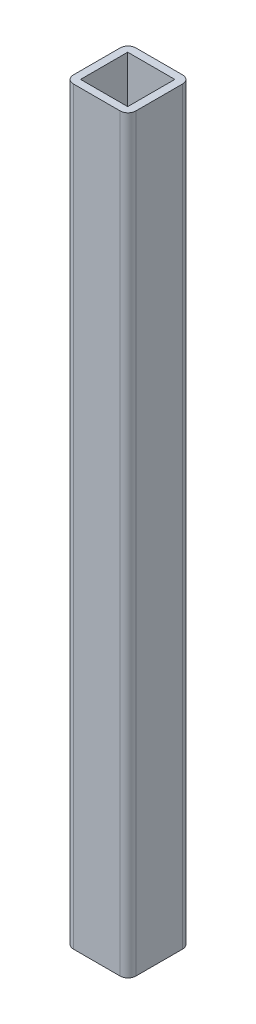
ISO-10303-21;
HEADER;
FILE_DESCRIPTION(('STEP AP214'),'2;1');
FILE_NAME('part.step','',(''),(''),'','','');
FILE_SCHEMA(('AUTOMOTIVE_DESIGN { 1 0 10303 214 1 1 1 1 }'));
ENDSEC;
DATA;
#1=APPLICATION_CONTEXT('core data for automotive mechanical design processes');
#2=APPLICATION_PROTOCOL_DEFINITION('international standard','automotive_design',2000,#1);
#3=PRODUCT_CONTEXT('',#1,'mechanical');
#4=PRODUCT('Part','Part','',(#3));
#5=PRODUCT_RELATED_PRODUCT_CATEGORY('part','',(#4));
#6=PRODUCT_DEFINITION_FORMATION('','',#4);
#7=PRODUCT_DEFINITION_CONTEXT('part definition',#1,'design');
#8=PRODUCT_DEFINITION('design','',#6,#7);
#9=PRODUCT_DEFINITION_SHAPE('','',#8);
#10=(LENGTH_UNIT() NAMED_UNIT(*) SI_UNIT(.MILLI.,.METRE.));
#11=(NAMED_UNIT(*) PLANE_ANGLE_UNIT() SI_UNIT($,.RADIAN.));
#12=(NAMED_UNIT(*) SI_UNIT($,.STERADIAN.) SOLID_ANGLE_UNIT());
#13=UNCERTAINTY_MEASURE_WITH_UNIT(LENGTH_MEASURE(1.E-05),#10,'distance_accuracy_value','');
#14=(GEOMETRIC_REPRESENTATION_CONTEXT(3) GLOBAL_UNCERTAINTY_ASSIGNED_CONTEXT((#13)) GLOBAL_UNIT_ASSIGNED_CONTEXT((#10,
#11,#12)) REPRESENTATION_CONTEXT('',''));
#15=CARTESIAN_POINT('',(0.,0.,0.));
#16=DIRECTION('',(0.,0.,1.));
#17=DIRECTION('',(1.,0.,0.));
#18=AXIS2_PLACEMENT_3D('',#15,#16,#17);
#19=CARTESIAN_POINT('',(-19.05,609.6,-19.05));
#20=DIRECTION('',(0.,1.,0.));
#21=DIRECTION('',(0.,0.,1.));
#22=AXIS2_PLACEMENT_3D('',#19,#20,#21);
#23=PLANE('',#22);
#24=CARTESIAN_POINT('',(-19.05,609.6,-19.05));
#25=DIRECTION('',(0.,1.,0.));
#26=DIRECTION('',(0.,0.,1.));
#27=AXIS2_PLACEMENT_3D('',#24,#25,#26);
#28=CIRCLE('',#27,6.35);
#29=CARTESIAN_POINT('',(-19.05,609.6,-25.4));
#30=VERTEX_POINT('',#29);
#31=CARTESIAN_POINT('',(-25.4,609.6,-19.05));
#32=VERTEX_POINT('',#31);
#33=EDGE_CURVE('E161',#30,#32,#28,.T.);
#34=ORIENTED_EDGE('',*,*,#33,.T.);
#35=DIRECTION('',(0.,0.,1.));
#36=VECTOR('',#35,1.);
#37=CARTESIAN_POINT('',(-25.4,609.6,19.05));
#38=LINE('',#37,#36);
#39=CARTESIAN_POINT('',(-25.4,609.6,19.05));
#40=VERTEX_POINT('',#39);
#41=EDGE_CURVE('E164',#32,#40,#38,.T.);
#42=ORIENTED_EDGE('',*,*,#41,.T.);
#43=CARTESIAN_POINT('',(-19.05,609.6,19.05));
#44=DIRECTION('',(0.,1.,0.));
#45=DIRECTION('',(0.,0.,1.));
#46=AXIS2_PLACEMENT_3D('',#43,#44,#45);
#47=CIRCLE('',#46,6.35);
#48=CARTESIAN_POINT('',(-19.05,609.6,25.4));
#49=VERTEX_POINT('',#48);
#50=EDGE_CURVE('E167',#40,#49,#47,.T.);
#51=ORIENTED_EDGE('',*,*,#50,.T.);
#52=DIRECTION('',(1.,0.,0.));
#53=VECTOR('',#52,1.);
#54=CARTESIAN_POINT('',(-19.05,609.6,25.4));
#55=LINE('',#54,#53);
#56=CARTESIAN_POINT('',(19.05,609.6,25.4));
#57=VERTEX_POINT('',#56);
#58=EDGE_CURVE('E169',#49,#57,#55,.T.);
#59=ORIENTED_EDGE('',*,*,#58,.T.);
#60=CARTESIAN_POINT('',(19.05,609.6,19.05));
#61=DIRECTION('',(0.,1.,0.));
#62=DIRECTION('',(0.,0.,1.));
#63=AXIS2_PLACEMENT_3D('',#60,#61,#62);
#64=CIRCLE('',#63,6.35);
#65=CARTESIAN_POINT('',(25.4,609.6,19.05));
#66=VERTEX_POINT('',#65);
#67=EDGE_CURVE('E171',#57,#66,#64,.T.);
#68=ORIENTED_EDGE('',*,*,#67,.T.);
#69=DIRECTION('',(0.,0.,-1.));
#70=VECTOR('',#69,1.);
#71=CARTESIAN_POINT('',(25.4,609.6,19.05));
#72=LINE('',#71,#70);
#73=CARTESIAN_POINT('',(25.4,609.6,-19.05));
#74=VERTEX_POINT('',#73);
#75=EDGE_CURVE('E173',#66,#74,#72,.T.);
#76=ORIENTED_EDGE('',*,*,#75,.T.);
#77=CARTESIAN_POINT('',(19.05,609.6,-19.05));
#78=DIRECTION('',(0.,1.,0.));
#79=DIRECTION('',(0.,0.,1.));
#80=AXIS2_PLACEMENT_3D('',#77,#78,#79);
#81=CIRCLE('',#80,6.35000000000001);
#82=CARTESIAN_POINT('',(19.05,609.6,-25.4));
#83=VERTEX_POINT('',#82);
#84=EDGE_CURVE('E175',#74,#83,#81,.T.);
#85=ORIENTED_EDGE('',*,*,#84,.T.);
#86=DIRECTION('',(-1.,0.,0.));
#87=VECTOR('',#86,1.);
#88=CARTESIAN_POINT('',(-19.05,609.6,-25.4));
#89=LINE('',#88,#87);
#90=EDGE_CURVE('E177',#83,#30,#89,.T.);
#91=ORIENTED_EDGE('',*,*,#90,.T.);
#92=EDGE_LOOP('',(#34,#42,#51,#59,#68,#76,#85,#91));
#93=FACE_BOUND('',#92,.T.);
#94=DIRECTION('',(1.,0.,0.));
#95=VECTOR('',#94,1.);
#96=CARTESIAN_POINT('',(-19.304,609.6,19.304));
#97=LINE('',#96,#95);
#98=CARTESIAN_POINT('',(-19.304,609.6,19.304));
#99=VERTEX_POINT('',#98);
#100=CARTESIAN_POINT('',(19.05,609.6,19.304));
#101=VERTEX_POINT('',#100);
#102=EDGE_CURVE('E133',#99,#101,#97,.T.);
#103=ORIENTED_EDGE('',*,*,#102,.F.);
#104=DIRECTION('',(0.,0.,1.));
#105=VECTOR('',#104,1.);
#106=CARTESIAN_POINT('',(-19.304,609.6,19.304));
#107=LINE('',#106,#105);
#108=CARTESIAN_POINT('',(-19.304,609.6,-19.05));
#109=VERTEX_POINT('',#108);
#110=EDGE_CURVE('E125',#109,#99,#107,.T.);
#111=ORIENTED_EDGE('',*,*,#110,.F.);
#112=DIRECTION('',(-1.,0.,0.));
#113=VECTOR('',#112,1.);
#114=CARTESIAN_POINT('',(-19.304,609.6,-19.05));
#115=LINE('',#114,#113);
#116=CARTESIAN_POINT('',(19.05,609.6,-19.05));
#117=VERTEX_POINT('',#116);
#118=EDGE_CURVE('E147',#117,#109,#115,.T.);
#119=ORIENTED_EDGE('',*,*,#118,.F.);
#120=DIRECTION('',(0.,0.,-1.));
#121=VECTOR('',#120,1.);
#122=CARTESIAN_POINT('',(19.05,609.6,19.304));
#123=LINE('',#122,#121);
#124=EDGE_CURVE('E145',#101,#117,#123,.T.);
#125=ORIENTED_EDGE('',*,*,#124,.F.);
#126=EDGE_LOOP('',(#103,#111,#119,#125));
#127=FACE_BOUND('',#126,.T.);
#128=ADVANCED_FACE('F36',(#93,#127),#23,.T.);
#129=CARTESIAN_POINT('',(-19.05,0.,-19.05));
#130=DIRECTION('',(0.,1.,0.));
#131=DIRECTION('',(0.,0.,1.));
#132=AXIS2_PLACEMENT_3D('',#129,#130,#131);
#133=PLANE('',#132);
#134=CARTESIAN_POINT('',(-19.05,0.,-19.05));
#135=DIRECTION('',(0.,1.,0.));
#136=DIRECTION('',(0.,0.,1.));
#137=AXIS2_PLACEMENT_3D('',#134,#135,#136);
#138=CIRCLE('',#137,6.35);
#139=CARTESIAN_POINT('',(-19.05,0.,-25.4));
#140=VERTEX_POINT('',#139);
#141=CARTESIAN_POINT('',(-25.4,0.,-19.05));
#142=VERTEX_POINT('',#141);
#143=EDGE_CURVE('E141',#140,#142,#138,.T.);
#144=ORIENTED_EDGE('',*,*,#143,.F.);
#145=DIRECTION('',(-1.,0.,0.));
#146=VECTOR('',#145,1.);
#147=CARTESIAN_POINT('',(-19.05,0.,-25.4));
#148=LINE('',#147,#146);
#149=CARTESIAN_POINT('',(19.05,0.,-25.4));
#150=VERTEX_POINT('',#149);
#151=EDGE_CURVE('E165',#150,#140,#148,.T.);
#152=ORIENTED_EDGE('',*,*,#151,.F.);
#153=CARTESIAN_POINT('',(19.05,0.,-19.05));
#154=DIRECTION('',(0.,1.,0.));
#155=DIRECTION('',(0.,0.,1.));
#156=AXIS2_PLACEMENT_3D('',#153,#154,#155);
#157=CIRCLE('',#156,6.35000000000001);
#158=CARTESIAN_POINT('',(25.4,0.,-19.05));
#159=VERTEX_POINT('',#158);
#160=EDGE_CURVE('E192',#159,#150,#157,.T.);
#161=ORIENTED_EDGE('',*,*,#160,.F.);
#162=DIRECTION('',(0.,0.,-1.));
#163=VECTOR('',#162,1.);
#164=CARTESIAN_POINT('',(25.4,0.,19.05));
#165=LINE('',#164,#163);
#166=CARTESIAN_POINT('',(25.4,0.,19.05));
#167=VERTEX_POINT('',#166);
#168=EDGE_CURVE('E190',#167,#159,#165,.T.);
#169=ORIENTED_EDGE('',*,*,#168,.F.);
#170=CARTESIAN_POINT('',(19.05,0.,19.05));
#171=DIRECTION('',(0.,1.,0.));
#172=DIRECTION('',(0.,0.,1.));
#173=AXIS2_PLACEMENT_3D('',#170,#171,#172);
#174=CIRCLE('',#173,6.35);
#175=CARTESIAN_POINT('',(19.05,0.,25.4));
#176=VERTEX_POINT('',#175);
#177=EDGE_CURVE('E188',#176,#167,#174,.T.);
#178=ORIENTED_EDGE('',*,*,#177,.F.);
#179=DIRECTION('',(1.,0.,0.));
#180=VECTOR('',#179,1.);
#181=CARTESIAN_POINT('',(-19.05,0.,25.4));
#182=LINE('',#181,#180);
#183=CARTESIAN_POINT('',(-19.05,0.,25.4));
#184=VERTEX_POINT('',#183);
#185=EDGE_CURVE('E186',#184,#176,#182,.T.);
#186=ORIENTED_EDGE('',*,*,#185,.F.);
#187=CARTESIAN_POINT('',(-19.05,0.,19.05));
#188=DIRECTION('',(0.,1.,0.));
#189=DIRECTION('',(0.,0.,1.));
#190=AXIS2_PLACEMENT_3D('',#187,#188,#189);
#191=CIRCLE('',#190,6.35);
#192=CARTESIAN_POINT('',(-25.4,0.,19.05));
#193=VERTEX_POINT('',#192);
#194=EDGE_CURVE('E184',#193,#184,#191,.T.);
#195=ORIENTED_EDGE('',*,*,#194,.F.);
#196=DIRECTION('',(0.,0.,1.));
#197=VECTOR('',#196,1.);
#198=CARTESIAN_POINT('',(-25.4,0.,19.05));
#199=LINE('',#198,#197);
#200=EDGE_CURVE('E182',#142,#193,#199,.T.);
#201=ORIENTED_EDGE('',*,*,#200,.F.);
#202=EDGE_LOOP('',(#144,#152,#161,#169,#178,#186,#195,#201));
#203=FACE_BOUND('',#202,.T.);
#204=DIRECTION('',(0.,0.,1.));
#205=VECTOR('',#204,1.);
#206=CARTESIAN_POINT('',(-19.304,0.,19.304));
#207=LINE('',#206,#205);
#208=CARTESIAN_POINT('',(-19.304,0.,-19.05));
#209=VERTEX_POINT('',#208);
#210=CARTESIAN_POINT('',(-19.304,0.,19.304));
#211=VERTEX_POINT('',#210);
#212=EDGE_CURVE('E59',#209,#211,#207,.T.);
#213=ORIENTED_EDGE('',*,*,#212,.T.);
#214=DIRECTION('',(1.,0.,0.));
#215=VECTOR('',#214,1.);
#216=CARTESIAN_POINT('',(-19.304,0.,19.304));
#217=LINE('',#216,#215);
#218=CARTESIAN_POINT('',(19.05,0.,19.304));
#219=VERTEX_POINT('',#218);
#220=EDGE_CURVE('E140',#211,#219,#217,.T.);
#221=ORIENTED_EDGE('',*,*,#220,.T.);
#222=DIRECTION('',(0.,0.,-1.));
#223=VECTOR('',#222,1.);
#224=CARTESIAN_POINT('',(19.05,0.,19.304));
#225=LINE('',#224,#223);
#226=CARTESIAN_POINT('',(19.05,0.,-19.05));
#227=VERTEX_POINT('',#226);
#228=EDGE_CURVE('E153',#219,#227,#225,.T.);
#229=ORIENTED_EDGE('',*,*,#228,.T.);
#230=DIRECTION('',(-1.,0.,0.));
#231=VECTOR('',#230,1.);
#232=CARTESIAN_POINT('',(-19.304,0.,-19.05));
#233=LINE('',#232,#231);
#234=EDGE_CURVE('E134',#227,#209,#233,.T.);
#235=ORIENTED_EDGE('',*,*,#234,.T.);
#236=EDGE_LOOP('',(#213,#221,#229,#235));
#237=FACE_BOUND('',#236,.T.);
#238=ADVANCED_FACE('F222',(#203,#237),#133,.F.);
#239=CARTESIAN_POINT('',(-19.05,609.6,-19.05));
#240=DIRECTION('',(0.,-1.,0.));
#241=DIRECTION('',(0.,0.,-1.));
#242=AXIS2_PLACEMENT_3D('',#239,#240,#241);
#243=CYLINDRICAL_SURFACE('',#242,6.35);
#244=ORIENTED_EDGE('',*,*,#143,.T.);
#245=DIRECTION('',(0.,-1.,0.));
#246=VECTOR('',#245,1.);
#247=CARTESIAN_POINT('',(-25.4,609.6,-19.05));
#248=LINE('',#247,#246);
#249=EDGE_CURVE('E11',#32,#142,#248,.T.);
#250=ORIENTED_EDGE('',*,*,#249,.F.);
#251=ORIENTED_EDGE('',*,*,#33,.F.);
#252=DIRECTION('',(0.,-1.,0.));
#253=VECTOR('',#252,1.);
#254=CARTESIAN_POINT('',(-19.05,609.6,-25.4));
#255=LINE('',#254,#253);
#256=EDGE_CURVE('E179',#30,#140,#255,.T.);
#257=ORIENTED_EDGE('',*,*,#256,.T.);
#258=EDGE_LOOP('',(#244,#250,#251,#257));
#259=FACE_BOUND('',#258,.T.);
#260=ADVANCED_FACE('F38',(#259),#243,.T.);
#261=CARTESIAN_POINT('',(-25.4,609.6,19.05));
#262=DIRECTION('',(1.,0.,0.));
#263=DIRECTION('',(0.,0.,-1.));
#264=AXIS2_PLACEMENT_3D('',#261,#262,#263);
#265=PLANE('',#264);
#266=ORIENTED_EDGE('',*,*,#200,.T.);
#267=DIRECTION('',(0.,-1.,0.));
#268=VECTOR('',#267,1.);
#269=CARTESIAN_POINT('',(-25.4,609.6,19.05));
#270=LINE('',#269,#268);
#271=EDGE_CURVE('E44',#40,#193,#270,.T.);
#272=ORIENTED_EDGE('',*,*,#271,.F.);
#273=ORIENTED_EDGE('',*,*,#41,.F.);
#274=ORIENTED_EDGE('',*,*,#249,.T.);
#275=EDGE_LOOP('',(#266,#272,#273,#274));
#276=FACE_BOUND('',#275,.T.);
#277=ADVANCED_FACE('F239',(#276),#265,.F.);
#278=CARTESIAN_POINT('',(-19.05,609.6,19.05));
#279=DIRECTION('',(0.,-1.,0.));
#280=DIRECTION('',(0.,0.,-1.));
#281=AXIS2_PLACEMENT_3D('',#278,#279,#280);
#282=CYLINDRICAL_SURFACE('',#281,6.35);
#283=ORIENTED_EDGE('',*,*,#194,.T.);
#284=DIRECTION('',(0.,-1.,0.));
#285=VECTOR('',#284,1.);
#286=CARTESIAN_POINT('',(-19.05,609.6,25.4));
#287=LINE('',#286,#285);
#288=EDGE_CURVE('E209',#49,#184,#287,.T.);
#289=ORIENTED_EDGE('',*,*,#288,.F.);
#290=ORIENTED_EDGE('',*,*,#50,.F.);
#291=ORIENTED_EDGE('',*,*,#271,.T.);
#292=EDGE_LOOP('',(#283,#289,#290,#291));
#293=FACE_BOUND('',#292,.T.);
#294=ADVANCED_FACE('F216',(#293),#282,.T.);
#295=CARTESIAN_POINT('',(-19.05,609.6,25.4));
#296=DIRECTION('',(0.,0.,-1.));
#297=DIRECTION('',(-1.,0.,0.));
#298=AXIS2_PLACEMENT_3D('',#295,#296,#297);
#299=PLANE('',#298);
#300=ORIENTED_EDGE('',*,*,#185,.T.);
#301=DIRECTION('',(0.,-1.,0.));
#302=VECTOR('',#301,1.);
#303=CARTESIAN_POINT('',(19.05,609.6,25.4));
#304=LINE('',#303,#302);
#305=EDGE_CURVE('E206',#57,#176,#304,.T.);
#306=ORIENTED_EDGE('',*,*,#305,.F.);
#307=ORIENTED_EDGE('',*,*,#58,.F.);
#308=ORIENTED_EDGE('',*,*,#288,.T.);
#309=EDGE_LOOP('',(#300,#306,#307,#308));
#310=FACE_BOUND('',#309,.T.);
#311=ADVANCED_FACE('F228',(#310),#299,.F.);
#312=CARTESIAN_POINT('',(19.05,609.6,19.05));
#313=DIRECTION('',(0.,-1.,0.));
#314=DIRECTION('',(0.,0.,-1.));
#315=AXIS2_PLACEMENT_3D('',#312,#313,#314);
#316=CYLINDRICAL_SURFACE('',#315,6.35);
#317=ORIENTED_EDGE('',*,*,#177,.T.);
#318=DIRECTION('',(0.,-1.,0.));
#319=VECTOR('',#318,1.);
#320=CARTESIAN_POINT('',(25.4,609.6,19.05));
#321=LINE('',#320,#319);
#322=EDGE_CURVE('E203',#66,#167,#321,.T.);
#323=ORIENTED_EDGE('',*,*,#322,.F.);
#324=ORIENTED_EDGE('',*,*,#67,.F.);
#325=ORIENTED_EDGE('',*,*,#305,.T.);
#326=EDGE_LOOP('',(#317,#323,#324,#325));
#327=FACE_BOUND('',#326,.T.);
#328=ADVANCED_FACE('F232',(#327),#316,.T.);
#329=CARTESIAN_POINT('',(25.4,609.6,19.05));
#330=DIRECTION('',(-1.,0.,0.));
#331=DIRECTION('',(0.,0.,1.));
#332=AXIS2_PLACEMENT_3D('',#329,#330,#331);
#333=PLANE('',#332);
#334=ORIENTED_EDGE('',*,*,#168,.T.);
#335=DIRECTION('',(0.,-1.,0.));
#336=VECTOR('',#335,1.);
#337=CARTESIAN_POINT('',(25.4,609.6,-19.05));
#338=LINE('',#337,#336);
#339=EDGE_CURVE('E200',#74,#159,#338,.T.);
#340=ORIENTED_EDGE('',*,*,#339,.F.);
#341=ORIENTED_EDGE('',*,*,#75,.F.);
#342=ORIENTED_EDGE('',*,*,#322,.T.);
#343=EDGE_LOOP('',(#334,#340,#341,#342));
#344=FACE_BOUND('',#343,.T.);
#345=ADVANCED_FACE('F252',(#344),#333,.F.);
#346=CARTESIAN_POINT('',(19.05,609.6,-19.05));
#347=DIRECTION('',(0.,-1.,0.));
#348=DIRECTION('',(0.,0.,-1.));
#349=AXIS2_PLACEMENT_3D('',#346,#347,#348);
#350=CYLINDRICAL_SURFACE('',#349,6.35000000000001);
#351=ORIENTED_EDGE('',*,*,#160,.T.);
#352=DIRECTION('',(0.,-1.,0.));
#353=VECTOR('',#352,1.);
#354=CARTESIAN_POINT('',(19.05,609.6,-25.4));
#355=LINE('',#354,#353);
#356=EDGE_CURVE('E197',#83,#150,#355,.T.);
#357=ORIENTED_EDGE('',*,*,#356,.F.);
#358=ORIENTED_EDGE('',*,*,#84,.F.);
#359=ORIENTED_EDGE('',*,*,#339,.T.);
#360=EDGE_LOOP('',(#351,#357,#358,#359));
#361=FACE_BOUND('',#360,.T.);
#362=ADVANCED_FACE('F250',(#361),#350,.T.);
#363=CARTESIAN_POINT('',(-19.05,609.6,-25.4));
#364=DIRECTION('',(0.,0.,1.));
#365=DIRECTION('',(1.,0.,0.));
#366=AXIS2_PLACEMENT_3D('',#363,#364,#365);
#367=PLANE('',#366);
#368=ORIENTED_EDGE('',*,*,#151,.T.);
#369=ORIENTED_EDGE('',*,*,#256,.F.);
#370=ORIENTED_EDGE('',*,*,#90,.F.);
#371=ORIENTED_EDGE('',*,*,#356,.T.);
#372=EDGE_LOOP('',(#368,#369,#370,#371));
#373=FACE_BOUND('',#372,.T.);
#374=ADVANCED_FACE('F245',(#373),#367,.F.);
#375=CARTESIAN_POINT('',(-19.304,609.6,19.304));
#376=DIRECTION('',(1.,0.,0.));
#377=DIRECTION('',(0.,0.,-1.));
#378=AXIS2_PLACEMENT_3D('',#375,#376,#377);
#379=PLANE('',#378);
#380=ORIENTED_EDGE('',*,*,#212,.F.);
#381=DIRECTION('',(0.,-1.,0.));
#382=VECTOR('',#381,1.);
#383=CARTESIAN_POINT('',(-19.304,609.6,-19.05));
#384=LINE('',#383,#382);
#385=EDGE_CURVE('E129',#109,#209,#384,.T.);
#386=ORIENTED_EDGE('',*,*,#385,.F.);
#387=ORIENTED_EDGE('',*,*,#110,.T.);
#388=DIRECTION('',(0.,-1.,0.));
#389=VECTOR('',#388,1.);
#390=CARTESIAN_POINT('',(-19.304,609.6,19.304));
#391=LINE('',#390,#389);
#392=EDGE_CURVE('E128',#99,#211,#391,.T.);
#393=ORIENTED_EDGE('',*,*,#392,.T.);
#394=EDGE_LOOP('',(#380,#386,#387,#393));
#395=FACE_BOUND('',#394,.T.);
#396=ADVANCED_FACE('F127',(#395),#379,.T.);
#397=CARTESIAN_POINT('',(-19.304,609.6,19.304));
#398=DIRECTION('',(0.,0.,-1.));
#399=DIRECTION('',(-1.,0.,0.));
#400=AXIS2_PLACEMENT_3D('',#397,#398,#399);
#401=PLANE('',#400);
#402=ORIENTED_EDGE('',*,*,#220,.F.);
#403=ORIENTED_EDGE('',*,*,#392,.F.);
#404=ORIENTED_EDGE('',*,*,#102,.T.);
#405=DIRECTION('',(0.,-1.,0.));
#406=VECTOR('',#405,1.);
#407=CARTESIAN_POINT('',(19.05,609.6,19.304));
#408=LINE('',#407,#406);
#409=EDGE_CURVE('E142',#101,#219,#408,.T.);
#410=ORIENTED_EDGE('',*,*,#409,.T.);
#411=EDGE_LOOP('',(#402,#403,#404,#410));
#412=FACE_BOUND('',#411,.T.);
#413=ADVANCED_FACE('F137',(#412),#401,.T.);
#414=CARTESIAN_POINT('',(19.05,609.6,19.304));
#415=DIRECTION('',(-1.,0.,0.));
#416=DIRECTION('',(0.,0.,1.));
#417=AXIS2_PLACEMENT_3D('',#414,#415,#416);
#418=PLANE('',#417);
#419=ORIENTED_EDGE('',*,*,#228,.F.);
#420=ORIENTED_EDGE('',*,*,#409,.F.);
#421=ORIENTED_EDGE('',*,*,#124,.T.);
#422=DIRECTION('',(0.,-1.,0.));
#423=VECTOR('',#422,1.);
#424=CARTESIAN_POINT('',(19.05,609.6,-19.05));
#425=LINE('',#424,#423);
#426=EDGE_CURVE('E51',#117,#227,#425,.T.);
#427=ORIENTED_EDGE('',*,*,#426,.T.);
#428=EDGE_LOOP('',(#419,#420,#421,#427));
#429=FACE_BOUND('',#428,.T.);
#430=ADVANCED_FACE('F277',(#429),#418,.T.);
#431=CARTESIAN_POINT('',(-19.304,609.6,-19.05));
#432=DIRECTION('',(0.,0.,1.));
#433=DIRECTION('',(1.,0.,0.));
#434=AXIS2_PLACEMENT_3D('',#431,#432,#433);
#435=PLANE('',#434);
#436=ORIENTED_EDGE('',*,*,#234,.F.);
#437=ORIENTED_EDGE('',*,*,#426,.F.);
#438=ORIENTED_EDGE('',*,*,#118,.T.);
#439=ORIENTED_EDGE('',*,*,#385,.T.);
#440=EDGE_LOOP('',(#436,#437,#438,#439));
#441=FACE_BOUND('',#440,.T.);
#442=ADVANCED_FACE('F281',(#441),#435,.T.);
#443=CLOSED_SHELL('',(#128,#238,#260,#277,#294,#311,#328,#345,#362,#374,#396,#413,#430,#442));
#444=MANIFOLD_SOLID_BREP('B2',#443);
#445=ADVANCED_BREP_SHAPE_REPRESENTATION('',(#18,#444),#14);
#446=SHAPE_DEFINITION_REPRESENTATION(#9,#445);
ENDSEC;
END-ISO-10303-21;
